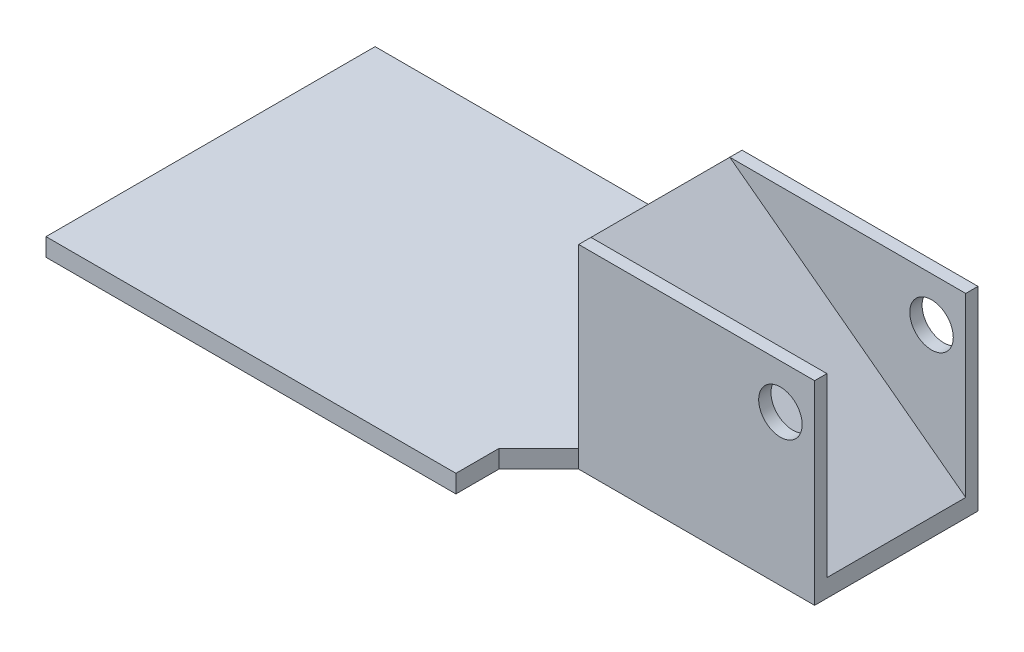
ISO-10303-21;
HEADER;
FILE_DESCRIPTION(('STEP AP214'),'2;1');
FILE_NAME('part.step','',(''),(''),'','','');
FILE_SCHEMA(('AUTOMOTIVE_DESIGN { 1 0 10303 214 1 1 1 1 }'));
ENDSEC;
DATA;
#1=APPLICATION_CONTEXT('core data for automotive mechanical design processes');
#2=APPLICATION_PROTOCOL_DEFINITION('international standard','automotive_design',2000,#1);
#3=PRODUCT_CONTEXT('',#1,'mechanical');
#4=PRODUCT('Part','Part','',(#3));
#5=PRODUCT_RELATED_PRODUCT_CATEGORY('part','',(#4));
#6=PRODUCT_DEFINITION_FORMATION('','',#4);
#7=PRODUCT_DEFINITION_CONTEXT('part definition',#1,'design');
#8=PRODUCT_DEFINITION('design','',#6,#7);
#9=PRODUCT_DEFINITION_SHAPE('','',#8);
#10=(LENGTH_UNIT() NAMED_UNIT(*) SI_UNIT(.MILLI.,.METRE.));
#11=(NAMED_UNIT(*) PLANE_ANGLE_UNIT() SI_UNIT($,.RADIAN.));
#12=(NAMED_UNIT(*) SI_UNIT($,.STERADIAN.) SOLID_ANGLE_UNIT());
#13=UNCERTAINTY_MEASURE_WITH_UNIT(LENGTH_MEASURE(1.E-05),#10,'distance_accuracy_value','');
#14=(GEOMETRIC_REPRESENTATION_CONTEXT(3) GLOBAL_UNCERTAINTY_ASSIGNED_CONTEXT((#13)) GLOBAL_UNIT_ASSIGNED_CONTEXT((#10,
#11,#12)) REPRESENTATION_CONTEXT('',''));
#15=CARTESIAN_POINT('',(0.,0.,0.));
#16=DIRECTION('',(0.,0.,1.));
#17=DIRECTION('',(1.,0.,0.));
#18=AXIS2_PLACEMENT_3D('',#15,#16,#17);
#19=CARTESIAN_POINT('',(0.,2.05994,0.));
#20=DIRECTION('',(0.,1.,0.));
#21=DIRECTION('',(0.,0.,1.));
#22=AXIS2_PLACEMENT_3D('',#19,#20,#21);
#23=PLANE('',#22);
#24=DIRECTION('',(-1.,0.,0.));
#25=VECTOR('',#24,1.);
#26=CARTESIAN_POINT('',(6.75557992798762,2.05994,29.8060041441728));
#27=LINE('',#26,#25);
#28=CARTESIAN_POINT('',(30.5689196087146,2.05994,29.8060041441728));
#29=VERTEX_POINT('',#28);
#30=CARTESIAN_POINT('',(6.75557992798762,2.05994,29.8060041441728));
#31=VERTEX_POINT('',#30);
#32=EDGE_CURVE('E201',#29,#31,#27,.T.);
#33=ORIENTED_EDGE('',*,*,#32,.F.);
#34=DIRECTION('',(0.,0.,-1.));
#35=VECTOR('',#34,1.);
#36=CARTESIAN_POINT('',(30.5689196087146,2.05994,29.8717192340563));
#37=LINE('',#36,#35);
#38=CARTESIAN_POINT('',(30.5689196087146,2.05994,13.8417792340563));
#39=VERTEX_POINT('',#38);
#40=EDGE_CURVE('E57',#29,#39,#37,.T.);
#41=ORIENTED_EDGE('',*,*,#40,.T.);
#42=DIRECTION('',(1.,0.,0.));
#43=VECTOR('',#42,1.);
#44=CARTESIAN_POINT('',(33.8878599279876,2.05994,13.8417792340563));
#45=LINE('',#44,#43);
#46=CARTESIAN_POINT('',(6.75557992798762,2.05994,13.8417792340563));
#47=VERTEX_POINT('',#46);
#48=EDGE_CURVE('E223',#47,#39,#45,.T.);
#49=ORIENTED_EDGE('',*,*,#48,.F.);
#50=DIRECTION('',(0.,0.,1.));
#51=VECTOR('',#50,1.);
#52=CARTESIAN_POINT('',(6.75557992798762,2.05994,13.8417792340563));
#53=LINE('',#52,#51);
#54=CARTESIAN_POINT('',(6.75557992798762,2.05994,12.4295392340563));
#55=VERTEX_POINT('',#54);
#56=EDGE_CURVE('E164',#55,#47,#53,.T.);
#57=ORIENTED_EDGE('',*,*,#56,.F.);
#58=DIRECTION('',(-0.707106781186546,0.,-0.707106781186549));
#59=VECTOR('',#58,1.);
#60=CARTESIAN_POINT('',(2.16579992798763,2.05994,7.83975923405626));
#61=LINE('',#60,#59);
#62=CARTESIAN_POINT('',(2.16579992798763,2.05994,7.83975923405626));
#63=VERTEX_POINT('',#62);
#64=EDGE_CURVE('E176',#55,#63,#61,.T.);
#65=ORIENTED_EDGE('',*,*,#64,.T.);
#66=DIRECTION('',(0.,0.,-1.));
#67=VECTOR('',#66,1.);
#68=CARTESIAN_POINT('',(2.16579992798763,2.05994,7.83975923405626));
#69=LINE('',#68,#67);
#70=CARTESIAN_POINT('',(2.16579992798763,2.05994,2.90089168911453));
#71=VERTEX_POINT('',#70);
#72=EDGE_CURVE('E251',#63,#71,#69,.T.);
#73=ORIENTED_EDGE('',*,*,#72,.T.);
#74=DIRECTION('',(-1.,0.,0.));
#75=VECTOR('',#74,1.);
#76=CARTESIAN_POINT('',(2.16579992798763,2.05994,2.90089168911453));
#77=LINE('',#76,#75);
#78=CARTESIAN_POINT('',(-44.9740600720124,2.05994,2.90089168911454));
#79=VERTEX_POINT('',#78);
#80=EDGE_CURVE('E239',#71,#79,#77,.T.);
#81=ORIENTED_EDGE('',*,*,#80,.T.);
#82=DIRECTION('',(0.,0.,1.));
#83=VECTOR('',#82,1.);
#84=CARTESIAN_POINT('',(-44.9740600720124,2.05994,2.90089168911454));
#85=LINE('',#84,#83);
#86=CARTESIAN_POINT('',(-44.9740600720124,2.05994,40.7468916891145));
#87=VERTEX_POINT('',#86);
#88=EDGE_CURVE('E242',#79,#87,#85,.T.);
#89=ORIENTED_EDGE('',*,*,#88,.T.);
#90=DIRECTION('',(1.,0.,0.));
#91=VECTOR('',#90,1.);
#92=CARTESIAN_POINT('',(-44.9740600720124,2.05994,40.7468916891145));
#93=LINE('',#92,#91);
#94=CARTESIAN_POINT('',(2.16579992798763,2.05994,40.7468916891145));
#95=VERTEX_POINT('',#94);
#96=EDGE_CURVE('E245',#87,#95,#93,.T.);
#97=ORIENTED_EDGE('',*,*,#96,.T.);
#98=DIRECTION('',(0.,0.,-1.));
#99=VECTOR('',#98,1.);
#100=CARTESIAN_POINT('',(2.16579992798763,2.05994,40.7468916891145));
#101=LINE('',#100,#99);
#102=CARTESIAN_POINT('',(2.16579992798763,2.05994,35.8080241441727));
#103=VERTEX_POINT('',#102);
#104=EDGE_CURVE('E247',#95,#103,#101,.T.);
#105=ORIENTED_EDGE('',*,*,#104,.T.);
#106=DIRECTION('',(0.707106781186552,0.,-0.707106781186543));
#107=VECTOR('',#106,1.);
#108=CARTESIAN_POINT('',(6.75557992798762,2.05994,31.2182441441728));
#109=LINE('',#108,#107);
#110=CARTESIAN_POINT('',(6.75557992798762,2.05994,31.2182441441728));
#111=VERTEX_POINT('',#110);
#112=EDGE_CURVE('E177',#103,#111,#109,.T.);
#113=ORIENTED_EDGE('',*,*,#112,.T.);
#114=DIRECTION('',(0.,0.,1.));
#115=VECTOR('',#114,1.);
#116=CARTESIAN_POINT('',(6.75557992798762,2.05994,31.2182441441728));
#117=LINE('',#116,#115);
#118=EDGE_CURVE('E204',#31,#111,#117,.T.);
#119=ORIENTED_EDGE('',*,*,#118,.F.);
#120=EDGE_LOOP('',(#33,#41,#49,#57,#65,#73,#81,#89,#97,#105,#113,#119));
#121=FACE_BOUND('',#120,.T.);
#122=ADVANCED_FACE('F33',(#121),#23,.T.);
#123=CARTESIAN_POINT('',(33.8878599279876,22.37994,13.8417792340563));
#124=DIRECTION('',(0.,0.,-1.));
#125=DIRECTION('',(-1.,0.,0.));
#126=AXIS2_PLACEMENT_3D('',#123,#124,#125);
#127=PLANE('',#126);
#128=DIRECTION('',(0.801501870641229,-0.59799226697225,0.));
#129=VECTOR('',#128,1.);
#130=CARTESIAN_POINT('',(6.75557992798762,19.8268267677945,13.8417792340563));
#131=LINE('',#130,#129);
#132=CARTESIAN_POINT('',(6.75557992798763,19.8268267677945,13.8417792340563));
#133=VERTEX_POINT('',#132);
#134=EDGE_CURVE('E49',#133,#39,#131,.T.);
#135=ORIENTED_EDGE('',*,*,#134,.F.);
#136=DIRECTION('',(0.,-1.,0.));
#137=VECTOR('',#136,1.);
#138=CARTESIAN_POINT('',(6.75557992798762,22.37994,13.8417792340563));
#139=LINE('',#138,#137);
#140=EDGE_CURVE('E233',#133,#47,#139,.T.);
#141=ORIENTED_EDGE('',*,*,#140,.T.);
#142=ORIENTED_EDGE('',*,*,#48,.T.);
#143=EDGE_LOOP('',(#135,#141,#142));
#144=FACE_BOUND('',#143,.T.);
#145=ADVANCED_FACE('F376',(#144),#127,.F.);
#146=CARTESIAN_POINT('',(29.9559399279876,17.2847,13.8417792340563));
#147=DIRECTION('',(0.,0.,-1.));
#148=DIRECTION('',(-1.,0.,0.));
#149=AXIS2_PLACEMENT_3D('',#146,#147,#148);
#150=CIRCLE('',#149,2.50063);
#151=CARTESIAN_POINT('',(27.4553099279876,17.2847,13.8417792340563));
#152=VERTEX_POINT('',#151);
#153=EDGE_CURVE('E195',#152,#152,#150,.T.);
#154=ORIENTED_EDGE('',*,*,#153,.T.);
#155=EDGE_LOOP('',(#154));
#156=FACE_BOUND('',#155,.T.);
#157=DIRECTION('',(-0.800413429281801,0.599448364936754,0.));
#158=VECTOR('',#157,1.);
#159=CARTESIAN_POINT('',(6.75557992798762,22.37994,13.8417792340563));
#160=LINE('',#159,#158);
#161=CARTESIAN_POINT('',(33.8878599279876,2.05994,13.8417792340563));
#162=VERTEX_POINT('',#161);
#163=CARTESIAN_POINT('',(6.75557992798762,22.37994,13.8417792340563));
#164=VERTEX_POINT('',#163);
#165=EDGE_CURVE('E355',#162,#164,#160,.T.);
#166=ORIENTED_EDGE('',*,*,#165,.F.);
#167=DIRECTION('',(0.,-1.,0.));
#168=VECTOR('',#167,1.);
#169=CARTESIAN_POINT('',(33.8878599279876,22.37994,13.8417792340563));
#170=LINE('',#169,#168);
#171=CARTESIAN_POINT('',(33.8878599279876,22.37994,13.8417792340563));
#172=VERTEX_POINT('',#171);
#173=EDGE_CURVE('E173',#172,#162,#170,.T.);
#174=ORIENTED_EDGE('',*,*,#173,.F.);
#175=DIRECTION('',(1.,0.,0.));
#176=VECTOR('',#175,1.);
#177=CARTESIAN_POINT('',(33.8878599279876,22.37994,13.8417792340563));
#178=LINE('',#177,#176);
#179=EDGE_CURVE('E227',#164,#172,#178,.T.);
#180=ORIENTED_EDGE('',*,*,#179,.F.);
#181=EDGE_LOOP('',(#166,#174,#180));
#182=FACE_BOUND('',#181,.T.);
#183=ADVANCED_FACE('F361',(#156,#182),#127,.F.);
#184=CARTESIAN_POINT('',(6.75557992798762,22.37994,29.8060041441728));
#185=DIRECTION('',(0.,0.,1.));
#186=DIRECTION('',(1.,0.,0.));
#187=AXIS2_PLACEMENT_3D('',#184,#185,#186);
#188=PLANE('',#187);
#189=DIRECTION('',(-0.801501870641229,0.59799226697225,0.));
#190=VECTOR('',#189,1.);
#191=CARTESIAN_POINT('',(5.53189338339606,20.7398066592554,29.8060041441728));
#192=LINE('',#191,#190);
#193=CARTESIAN_POINT('',(6.75557992798762,19.8268267677945,29.8060041441728));
#194=VERTEX_POINT('',#193);
#195=EDGE_CURVE('E183',#29,#194,#192,.T.);
#196=ORIENTED_EDGE('',*,*,#195,.F.);
#197=ORIENTED_EDGE('',*,*,#32,.T.);
#198=DIRECTION('',(0.,-1.,0.));
#199=VECTOR('',#198,1.);
#200=CARTESIAN_POINT('',(6.75557992798762,22.37994,29.8060041441728));
#201=LINE('',#200,#199);
#202=EDGE_CURVE('E165',#194,#31,#201,.T.);
#203=ORIENTED_EDGE('',*,*,#202,.F.);
#204=EDGE_LOOP('',(#196,#197,#203));
#205=FACE_BOUND('',#204,.T.);
#206=ADVANCED_FACE('F352',(#205),#188,.F.);
#207=CARTESIAN_POINT('',(29.9559399279876,17.2847,29.8060041441728));
#208=DIRECTION('',(0.,0.,1.));
#209=DIRECTION('',(1.,0.,0.));
#210=AXIS2_PLACEMENT_3D('',#207,#208,#209);
#211=CIRCLE('',#210,2.50063);
#212=CARTESIAN_POINT('',(32.4565699279876,17.2847,29.8060041441728));
#213=VERTEX_POINT('',#212);
#214=EDGE_CURVE('E37',#213,#213,#211,.T.);
#215=ORIENTED_EDGE('',*,*,#214,.T.);
#216=EDGE_LOOP('',(#215));
#217=FACE_BOUND('',#216,.T.);
#218=DIRECTION('',(0.800413429281801,-0.599448364936754,0.));
#219=VECTOR('',#218,1.);
#220=CARTESIAN_POINT('',(6.75557992798762,22.37994,29.8060041441728));
#221=LINE('',#220,#219);
#222=CARTESIAN_POINT('',(6.75557992798762,22.37994,29.8060041441728));
#223=VERTEX_POINT('',#222);
#224=CARTESIAN_POINT('',(33.8878599279876,2.05994,29.8060041441728));
#225=VERTEX_POINT('',#224);
#226=EDGE_CURVE('E158',#223,#225,#221,.T.);
#227=ORIENTED_EDGE('',*,*,#226,.F.);
#228=DIRECTION('',(-1.,0.,0.));
#229=VECTOR('',#228,1.);
#230=CARTESIAN_POINT('',(6.75557992798762,22.37994,29.8060041441728));
#231=LINE('',#230,#229);
#232=CARTESIAN_POINT('',(33.8878599279876,22.37994,29.8060041441728));
#233=VERTEX_POINT('',#232);
#234=EDGE_CURVE('E160',#233,#223,#231,.T.);
#235=ORIENTED_EDGE('',*,*,#234,.F.);
#236=DIRECTION('',(0.,-1.,0.));
#237=VECTOR('',#236,1.);
#238=CARTESIAN_POINT('',(33.8878599279876,22.37994,29.8060041441728));
#239=LINE('',#238,#237);
#240=EDGE_CURVE('E154',#233,#225,#239,.T.);
#241=ORIENTED_EDGE('',*,*,#240,.T.);
#242=EDGE_LOOP('',(#227,#235,#241));
#243=FACE_BOUND('',#242,.T.);
#244=ADVANCED_FACE('F156',(#217,#243),#188,.F.);
#245=CARTESIAN_POINT('',(2.16579992798763,2.05994,2.90089168911453));
#246=DIRECTION('',(0.,0.,1.));
#247=DIRECTION('',(1.,0.,0.));
#248=AXIS2_PLACEMENT_3D('',#245,#246,#247);
#249=PLANE('',#248);
#250=DIRECTION('',(-1.,0.,0.));
#251=VECTOR('',#250,1.);
#252=CARTESIAN_POINT('',(2.16579992798763,0.,2.90089168911453));
#253=LINE('',#252,#251);
#254=CARTESIAN_POINT('',(2.16579992798763,0.,2.90089168911453));
#255=VERTEX_POINT('',#254);
#256=CARTESIAN_POINT('',(-44.9740600720124,0.,2.90089168911454));
#257=VERTEX_POINT('',#256);
#258=EDGE_CURVE('E238',#255,#257,#253,.T.);
#259=ORIENTED_EDGE('',*,*,#258,.T.);
#260=DIRECTION('',(0.,-1.,0.));
#261=VECTOR('',#260,1.);
#262=CARTESIAN_POINT('',(-44.9740600720124,2.05994,2.90089168911454));
#263=LINE('',#262,#261);
#264=EDGE_CURVE('E11',#79,#257,#263,.T.);
#265=ORIENTED_EDGE('',*,*,#264,.F.);
#266=ORIENTED_EDGE('',*,*,#80,.F.);
#267=DIRECTION('',(0.,-1.,0.));
#268=VECTOR('',#267,1.);
#269=CARTESIAN_POINT('',(2.16579992798763,2.05994,2.90089168911453));
#270=LINE('',#269,#268);
#271=EDGE_CURVE('E253',#71,#255,#270,.T.);
#272=ORIENTED_EDGE('',*,*,#271,.T.);
#273=EDGE_LOOP('',(#259,#265,#266,#272));
#274=FACE_BOUND('',#273,.T.);
#275=ADVANCED_FACE('F35',(#274),#249,.F.);
#276=CARTESIAN_POINT('',(-44.9740600720124,2.05994,2.90089168911454));
#277=DIRECTION('',(1.,0.,0.));
#278=DIRECTION('',(0.,0.,-1.));
#279=AXIS2_PLACEMENT_3D('',#276,#277,#278);
#280=PLANE('',#279);
#281=DIRECTION('',(0.,0.,1.));
#282=VECTOR('',#281,1.);
#283=CARTESIAN_POINT('',(-44.9740600720124,0.,2.90089168911454));
#284=LINE('',#283,#282);
#285=CARTESIAN_POINT('',(-44.9740600720124,0.,40.7468916891145));
#286=VERTEX_POINT('',#285);
#287=EDGE_CURVE('E256',#257,#286,#284,.T.);
#288=ORIENTED_EDGE('',*,*,#287,.T.);
#289=DIRECTION('',(0.,-1.,0.));
#290=VECTOR('',#289,1.);
#291=CARTESIAN_POINT('',(-44.9740600720124,2.05994,40.7468916891145));
#292=LINE('',#291,#290);
#293=EDGE_CURVE('E42',#87,#286,#292,.T.);
#294=ORIENTED_EDGE('',*,*,#293,.F.);
#295=ORIENTED_EDGE('',*,*,#88,.F.);
#296=ORIENTED_EDGE('',*,*,#264,.T.);
#297=EDGE_LOOP('',(#288,#294,#295,#296));
#298=FACE_BOUND('',#297,.T.);
#299=ADVANCED_FACE('F321',(#298),#280,.F.);
#300=CARTESIAN_POINT('',(-44.9740600720124,2.05994,40.7468916891145));
#301=DIRECTION('',(0.,0.,-1.));
#302=DIRECTION('',(-1.,0.,0.));
#303=AXIS2_PLACEMENT_3D('',#300,#301,#302);
#304=PLANE('',#303);
#305=DIRECTION('',(1.,0.,0.));
#306=VECTOR('',#305,1.);
#307=CARTESIAN_POINT('',(-44.9740600720124,0.,40.7468916891145));
#308=LINE('',#307,#306);
#309=CARTESIAN_POINT('',(2.16579992798763,0.,40.7468916891145));
#310=VERTEX_POINT('',#309);
#311=EDGE_CURVE('E258',#286,#310,#308,.T.);
#312=ORIENTED_EDGE('',*,*,#311,.T.);
#313=DIRECTION('',(0.,-1.,0.));
#314=VECTOR('',#313,1.);
#315=CARTESIAN_POINT('',(2.16579992798763,2.05994,40.7468916891145));
#316=LINE('',#315,#314);
#317=EDGE_CURVE('E293',#95,#310,#316,.T.);
#318=ORIENTED_EDGE('',*,*,#317,.F.);
#319=ORIENTED_EDGE('',*,*,#96,.F.);
#320=ORIENTED_EDGE('',*,*,#293,.T.);
#321=EDGE_LOOP('',(#312,#318,#319,#320));
#322=FACE_BOUND('',#321,.T.);
#323=ADVANCED_FACE('F301',(#322),#304,.F.);
#324=CARTESIAN_POINT('',(2.16579992798763,2.05994,40.7468916891145));
#325=DIRECTION('',(-1.,0.,0.));
#326=DIRECTION('',(0.,0.,1.));
#327=AXIS2_PLACEMENT_3D('',#324,#325,#326);
#328=PLANE('',#327);
#329=DIRECTION('',(0.,0.,-1.));
#330=VECTOR('',#329,1.);
#331=CARTESIAN_POINT('',(2.16579992798763,0.,40.7468916891145));
#332=LINE('',#331,#330);
#333=CARTESIAN_POINT('',(2.16579992798763,0.,35.8080241441727));
#334=VERTEX_POINT('',#333);
#335=EDGE_CURVE('E260',#310,#334,#332,.T.);
#336=ORIENTED_EDGE('',*,*,#335,.T.);
#337=DIRECTION('',(0.,-1.,0.));
#338=VECTOR('',#337,1.);
#339=CARTESIAN_POINT('',(2.16579992798763,2.05994,35.8080241441727));
#340=LINE('',#339,#338);
#341=EDGE_CURVE('E290',#103,#334,#340,.T.);
#342=ORIENTED_EDGE('',*,*,#341,.F.);
#343=ORIENTED_EDGE('',*,*,#104,.F.);
#344=ORIENTED_EDGE('',*,*,#317,.T.);
#345=EDGE_LOOP('',(#336,#342,#343,#344));
#346=FACE_BOUND('',#345,.T.);
#347=ADVANCED_FACE('F312',(#346),#328,.F.);
#348=CARTESIAN_POINT('',(6.75557992798762,2.05994,31.2182441441728));
#349=DIRECTION('',(-0.707106781186543,0.,-0.707106781186552));
#350=DIRECTION('',(-0.707106781186552,0.,0.707106781186543));
#351=AXIS2_PLACEMENT_3D('',#348,#349,#350);
#352=PLANE('',#351);
#353=DIRECTION('',(0.707106781186552,0.,-0.707106781186543));
#354=VECTOR('',#353,1.);
#355=CARTESIAN_POINT('',(6.75557992798762,0.,31.2182441441728));
#356=LINE('',#355,#354);
#357=CARTESIAN_POINT('',(6.75557992798762,0.,31.2182441441728));
#358=VERTEX_POINT('',#357);
#359=EDGE_CURVE('E262',#334,#358,#356,.T.);
#360=ORIENTED_EDGE('',*,*,#359,.T.);
#361=DIRECTION('',(0.,-1.,0.));
#362=VECTOR('',#361,1.);
#363=CARTESIAN_POINT('',(6.75557992798762,2.05994,31.2182441441728));
#364=LINE('',#363,#362);
#365=EDGE_CURVE('E287',#111,#358,#364,.T.);
#366=ORIENTED_EDGE('',*,*,#365,.F.);
#367=ORIENTED_EDGE('',*,*,#112,.F.);
#368=ORIENTED_EDGE('',*,*,#341,.T.);
#369=EDGE_LOOP('',(#360,#366,#367,#368));
#370=FACE_BOUND('',#369,.T.);
#371=ADVANCED_FACE('F316',(#370),#352,.F.);
#372=CARTESIAN_POINT('',(33.8878599279876,2.05994,31.2182441441728));
#373=DIRECTION('',(0.,0.,-1.));
#374=DIRECTION('',(-1.,0.,0.));
#375=AXIS2_PLACEMENT_3D('',#372,#373,#374);
#376=PLANE('',#375);
#377=CARTESIAN_POINT('',(29.9559399279876,17.2847,31.2182441441728));
#378=DIRECTION('',(0.,0.,1.));
#379=DIRECTION('',(1.,0.,0.));
#380=AXIS2_PLACEMENT_3D('',#377,#378,#379);
#381=CIRCLE('',#380,2.50063);
#382=CARTESIAN_POINT('',(32.4565699279876,17.2847,31.2182441441728));
#383=VERTEX_POINT('',#382);
#384=EDGE_CURVE('E187',#383,#383,#381,.T.);
#385=ORIENTED_EDGE('',*,*,#384,.F.);
#386=EDGE_LOOP('',(#385));
#387=FACE_BOUND('',#386,.T.);
#388=DIRECTION('',(1.,0.,0.));
#389=VECTOR('',#388,1.);
#390=CARTESIAN_POINT('',(33.8878599279876,0.,31.2182441441728));
#391=LINE('',#390,#389);
#392=CARTESIAN_POINT('',(33.8878599279876,0.,31.2182441441728));
#393=VERTEX_POINT('',#392);
#394=EDGE_CURVE('E264',#358,#393,#391,.T.);
#395=ORIENTED_EDGE('',*,*,#394,.T.);
#396=DIRECTION('',(0.,-1.,0.));
#397=VECTOR('',#396,1.);
#398=CARTESIAN_POINT('',(33.8878599279876,2.05994,31.2182441441728));
#399=LINE('',#398,#397);
#400=CARTESIAN_POINT('',(33.8878599279876,22.37994,31.2182441441728));
#401=VERTEX_POINT('',#400);
#402=EDGE_CURVE('E284',#401,#393,#399,.T.);
#403=ORIENTED_EDGE('',*,*,#402,.F.);
#404=DIRECTION('',(1.,0.,0.));
#405=VECTOR('',#404,1.);
#406=CARTESIAN_POINT('',(33.8878599279876,22.37994,31.2182441441728));
#407=LINE('',#406,#405);
#408=CARTESIAN_POINT('',(6.75557992798762,22.37994,31.2182441441728));
#409=VERTEX_POINT('',#408);
#410=EDGE_CURVE('E208',#409,#401,#407,.T.);
#411=ORIENTED_EDGE('',*,*,#410,.F.);
#412=DIRECTION('',(0.,-1.,0.));
#413=VECTOR('',#412,1.);
#414=CARTESIAN_POINT('',(6.75557992798762,22.37994,31.2182441441728));
#415=LINE('',#414,#413);
#416=EDGE_CURVE('E211',#409,#111,#415,.T.);
#417=ORIENTED_EDGE('',*,*,#416,.T.);
#418=ORIENTED_EDGE('',*,*,#365,.T.);
#419=EDGE_LOOP('',(#395,#403,#411,#417,#418));
#420=FACE_BOUND('',#419,.T.);
#421=ADVANCED_FACE('F343',(#387,#420),#376,.F.);
#422=CARTESIAN_POINT('',(33.8878599279876,2.05994,12.4295392340563));
#423=DIRECTION('',(-1.,0.,0.));
#424=DIRECTION('',(0.,0.,1.));
#425=AXIS2_PLACEMENT_3D('',#422,#423,#424);
#426=PLANE('',#425);
#427=DIRECTION('',(0.,0.,-1.));
#428=VECTOR('',#427,1.);
#429=CARTESIAN_POINT('',(33.8878599279876,0.,12.4295392340563));
#430=LINE('',#429,#428);
#431=CARTESIAN_POINT('',(33.8878599279876,0.,12.4295392340563));
#432=VERTEX_POINT('',#431);
#433=EDGE_CURVE('E266',#393,#432,#430,.T.);
#434=ORIENTED_EDGE('',*,*,#433,.T.);
#435=DIRECTION('',(0.,-1.,0.));
#436=VECTOR('',#435,1.);
#437=CARTESIAN_POINT('',(33.8878599279876,2.05994,12.4295392340563));
#438=LINE('',#437,#436);
#439=CARTESIAN_POINT('',(33.8878599279876,22.37994,12.4295392340563));
#440=VERTEX_POINT('',#439);
#441=EDGE_CURVE('E281',#440,#432,#438,.T.);
#442=ORIENTED_EDGE('',*,*,#441,.F.);
#443=DIRECTION('',(0.,0.,-1.));
#444=VECTOR('',#443,1.);
#445=CARTESIAN_POINT('',(33.8878599279876,22.37994,12.4295392340563));
#446=LINE('',#445,#444);
#447=EDGE_CURVE('E219',#172,#440,#446,.T.);
#448=ORIENTED_EDGE('',*,*,#447,.F.);
#449=ORIENTED_EDGE('',*,*,#173,.T.);
#450=DIRECTION('',(0.,0.,-1.));
#451=VECTOR('',#450,1.);
#452=CARTESIAN_POINT('',(33.8878599279876,2.05994,12.4295392340563));
#453=LINE('',#452,#451);
#454=EDGE_CURVE('E169',#225,#162,#453,.T.);
#455=ORIENTED_EDGE('',*,*,#454,.F.);
#456=ORIENTED_EDGE('',*,*,#240,.F.);
#457=DIRECTION('',(0.,0.,-1.));
#458=VECTOR('',#457,1.);
#459=CARTESIAN_POINT('',(33.8878599279876,22.37994,29.8060041441728));
#460=LINE('',#459,#458);
#461=EDGE_CURVE('E202',#401,#233,#460,.T.);
#462=ORIENTED_EDGE('',*,*,#461,.F.);
#463=ORIENTED_EDGE('',*,*,#402,.T.);
#464=EDGE_LOOP('',(#434,#442,#448,#449,#455,#456,#462,#463));
#465=FACE_BOUND('',#464,.T.);
#466=ADVANCED_FACE('F170',(#465),#426,.F.);
#467=CARTESIAN_POINT('',(6.75557992798762,2.05994,12.4295392340563));
#468=DIRECTION('',(0.,0.,1.));
#469=DIRECTION('',(1.,0.,0.));
#470=AXIS2_PLACEMENT_3D('',#467,#468,#469);
#471=PLANE('',#470);
#472=CARTESIAN_POINT('',(29.9559399279876,17.2847,12.4295392340563));
#473=DIRECTION('',(0.,0.,1.));
#474=DIRECTION('',(1.,0.,0.));
#475=AXIS2_PLACEMENT_3D('',#472,#473,#474);
#476=CIRCLE('',#475,2.50063);
#477=CARTESIAN_POINT('',(32.4565699279876,17.2847,12.4295392340563));
#478=VERTEX_POINT('',#477);
#479=EDGE_CURVE('E198',#478,#478,#476,.T.);
#480=ORIENTED_EDGE('',*,*,#479,.T.);
#481=EDGE_LOOP('',(#480));
#482=FACE_BOUND('',#481,.T.);
#483=DIRECTION('',(-1.,0.,0.));
#484=VECTOR('',#483,1.);
#485=CARTESIAN_POINT('',(6.75557992798762,0.,12.4295392340563));
#486=LINE('',#485,#484);
#487=CARTESIAN_POINT('',(6.75557992798762,0.,12.4295392340563));
#488=VERTEX_POINT('',#487);
#489=EDGE_CURVE('E268',#432,#488,#486,.T.);
#490=ORIENTED_EDGE('',*,*,#489,.T.);
#491=DIRECTION('',(0.,-1.,0.));
#492=VECTOR('',#491,1.);
#493=CARTESIAN_POINT('',(6.75557992798762,2.05994,12.4295392340563));
#494=LINE('',#493,#492);
#495=EDGE_CURVE('E278',#55,#488,#494,.T.);
#496=ORIENTED_EDGE('',*,*,#495,.F.);
#497=DIRECTION('',(0.,-1.,0.));
#498=VECTOR('',#497,1.);
#499=CARTESIAN_POINT('',(6.75557992798762,22.37994,12.4295392340563));
#500=LINE('',#499,#498);
#501=CARTESIAN_POINT('',(6.75557992798762,22.37994,12.4295392340563));
#502=VERTEX_POINT('',#501);
#503=EDGE_CURVE('E235',#502,#55,#500,.T.);
#504=ORIENTED_EDGE('',*,*,#503,.F.);
#505=DIRECTION('',(-1.,0.,0.));
#506=VECTOR('',#505,1.);
#507=CARTESIAN_POINT('',(6.75557992798762,22.37994,12.4295392340563));
#508=LINE('',#507,#506);
#509=EDGE_CURVE('E222',#440,#502,#508,.T.);
#510=ORIENTED_EDGE('',*,*,#509,.F.);
#511=ORIENTED_EDGE('',*,*,#441,.T.);
#512=EDGE_LOOP('',(#490,#496,#504,#510,#511));
#513=FACE_BOUND('',#512,.T.);
#514=ADVANCED_FACE('F337',(#482,#513),#471,.F.);
#515=CARTESIAN_POINT('',(2.16579992798763,2.05994,7.83975923405626));
#516=DIRECTION('',(-0.707106781186549,0.,0.707106781186546));
#517=DIRECTION('',(0.707106781186546,0.,0.707106781186549));
#518=AXIS2_PLACEMENT_3D('',#515,#516,#517);
#519=PLANE('',#518);
#520=DIRECTION('',(-0.707106781186546,0.,-0.707106781186549));
#521=VECTOR('',#520,1.);
#522=CARTESIAN_POINT('',(2.16579992798763,0.,7.83975923405626));
#523=LINE('',#522,#521);
#524=CARTESIAN_POINT('',(2.16579992798763,0.,7.83975923405626));
#525=VERTEX_POINT('',#524);
#526=EDGE_CURVE('E270',#488,#525,#523,.T.);
#527=ORIENTED_EDGE('',*,*,#526,.T.);
#528=DIRECTION('',(0.,-1.,0.));
#529=VECTOR('',#528,1.);
#530=CARTESIAN_POINT('',(2.16579992798763,2.05994,7.83975923405626));
#531=LINE('',#530,#529);
#532=EDGE_CURVE('E275',#63,#525,#531,.T.);
#533=ORIENTED_EDGE('',*,*,#532,.F.);
#534=ORIENTED_EDGE('',*,*,#64,.F.);
#535=ORIENTED_EDGE('',*,*,#495,.T.);
#536=EDGE_LOOP('',(#527,#533,#534,#535));
#537=FACE_BOUND('',#536,.T.);
#538=ADVANCED_FACE('F333',(#537),#519,.F.);
#539=CARTESIAN_POINT('',(2.16579992798763,2.05994,7.83975923405626));
#540=DIRECTION('',(-1.,0.,0.));
#541=DIRECTION('',(0.,0.,1.));
#542=AXIS2_PLACEMENT_3D('',#539,#540,#541);
#543=PLANE('',#542);
#544=DIRECTION('',(0.,0.,-1.));
#545=VECTOR('',#544,1.);
#546=CARTESIAN_POINT('',(2.16579992798763,0.,7.83975923405626));
#547=LINE('',#546,#545);
#548=EDGE_CURVE('E243',#525,#255,#547,.T.);
#549=ORIENTED_EDGE('',*,*,#548,.T.);
#550=ORIENTED_EDGE('',*,*,#271,.F.);
#551=ORIENTED_EDGE('',*,*,#72,.F.);
#552=ORIENTED_EDGE('',*,*,#532,.T.);
#553=EDGE_LOOP('',(#549,#550,#551,#552));
#554=FACE_BOUND('',#553,.T.);
#555=ADVANCED_FACE('F328',(#554),#543,.F.);
#556=CARTESIAN_POINT('',(0.,0.,0.));
#557=DIRECTION('',(0.,1.,0.));
#558=DIRECTION('',(0.,0.,1.));
#559=AXIS2_PLACEMENT_3D('',#556,#557,#558);
#560=PLANE('',#559);
#561=ORIENTED_EDGE('',*,*,#258,.F.);
#562=ORIENTED_EDGE('',*,*,#548,.F.);
#563=ORIENTED_EDGE('',*,*,#526,.F.);
#564=ORIENTED_EDGE('',*,*,#489,.F.);
#565=ORIENTED_EDGE('',*,*,#433,.F.);
#566=ORIENTED_EDGE('',*,*,#394,.F.);
#567=ORIENTED_EDGE('',*,*,#359,.F.);
#568=ORIENTED_EDGE('',*,*,#335,.F.);
#569=ORIENTED_EDGE('',*,*,#311,.F.);
#570=ORIENTED_EDGE('',*,*,#287,.F.);
#571=EDGE_LOOP('',(#561,#562,#563,#564,#565,#566,#567,#568,#569,#570));
#572=FACE_BOUND('',#571,.T.);
#573=ADVANCED_FACE('F307',(#572),#560,.F.);
#574=CARTESIAN_POINT('',(6.75557992798762,22.37994,13.8417792340563));
#575=DIRECTION('',(1.,0.,0.));
#576=DIRECTION('',(0.,0.,-1.));
#577=AXIS2_PLACEMENT_3D('',#574,#575,#576);
#578=PLANE('',#577);
#579=ORIENTED_EDGE('',*,*,#56,.T.);
#580=ORIENTED_EDGE('',*,*,#140,.F.);
#581=DIRECTION('',(0.,0.,-1.));
#582=VECTOR('',#581,1.);
#583=CARTESIAN_POINT('',(6.75557992798762,19.8268267677945,29.8717192340563));
#584=LINE('',#583,#582);
#585=EDGE_CURVE('E184',#194,#133,#584,.T.);
#586=ORIENTED_EDGE('',*,*,#585,.F.);
#587=ORIENTED_EDGE('',*,*,#202,.T.);
#588=ORIENTED_EDGE('',*,*,#118,.T.);
#589=ORIENTED_EDGE('',*,*,#416,.F.);
#590=DIRECTION('',(0.,0.,1.));
#591=VECTOR('',#590,1.);
#592=CARTESIAN_POINT('',(6.75557992798762,22.37994,31.2182441441728));
#593=LINE('',#592,#591);
#594=EDGE_CURVE('E206',#223,#409,#593,.T.);
#595=ORIENTED_EDGE('',*,*,#594,.F.);
#596=DIRECTION('',(0.,0.,-1.));
#597=VECTOR('',#596,1.);
#598=CARTESIAN_POINT('',(6.75557992798762,22.37994,29.8717192340563));
#599=LINE('',#598,#597);
#600=EDGE_CURVE('E182',#223,#164,#599,.T.);
#601=ORIENTED_EDGE('',*,*,#600,.T.);
#602=DIRECTION('',(0.,0.,1.));
#603=VECTOR('',#602,1.);
#604=CARTESIAN_POINT('',(6.75557992798762,22.37994,13.8417792340563));
#605=LINE('',#604,#603);
#606=EDGE_CURVE('E225',#502,#164,#605,.T.);
#607=ORIENTED_EDGE('',*,*,#606,.F.);
#608=ORIENTED_EDGE('',*,*,#503,.T.);
#609=EDGE_LOOP('',(#579,#580,#586,#587,#588,#589,#595,#601,#607,#608));
#610=FACE_BOUND('',#609,.T.);
#611=ADVANCED_FACE('F349',(#610),#578,.F.);
#612=CARTESIAN_POINT('',(0.,22.37994,0.));
#613=DIRECTION('',(0.,-1.,0.));
#614=DIRECTION('',(0.,0.,-1.));
#615=AXIS2_PLACEMENT_3D('',#612,#613,#614);
#616=PLANE('',#615);
#617=ORIENTED_EDGE('',*,*,#447,.T.);
#618=ORIENTED_EDGE('',*,*,#509,.T.);
#619=ORIENTED_EDGE('',*,*,#606,.T.);
#620=ORIENTED_EDGE('',*,*,#179,.T.);
#621=EDGE_LOOP('',(#617,#618,#619,#620));
#622=FACE_BOUND('',#621,.T.);
#623=ADVANCED_FACE('F363',(#622),#616,.F.);
#624=CARTESIAN_POINT('',(0.,22.37994,0.));
#625=DIRECTION('',(0.,-1.,0.));
#626=DIRECTION('',(0.,0.,-1.));
#627=AXIS2_PLACEMENT_3D('',#624,#625,#626);
#628=PLANE('',#627);
#629=ORIENTED_EDGE('',*,*,#461,.T.);
#630=ORIENTED_EDGE('',*,*,#234,.T.);
#631=ORIENTED_EDGE('',*,*,#594,.T.);
#632=ORIENTED_EDGE('',*,*,#410,.T.);
#633=EDGE_LOOP('',(#629,#630,#631,#632));
#634=FACE_BOUND('',#633,.T.);
#635=ADVANCED_FACE('F345',(#634),#628,.F.);
#636=CARTESIAN_POINT('',(29.9559399279876,17.2847,5.8182441441728));
#637=DIRECTION('',(0.,0.,1.));
#638=DIRECTION('',(1.,0.,0.));
#639=AXIS2_PLACEMENT_3D('',#636,#637,#638);
#640=CYLINDRICAL_SURFACE('',#639,2.50063);
#641=ORIENTED_EDGE('',*,*,#384,.T.);
#642=EDGE_LOOP('',(#641));
#643=FACE_BOUND('',#642,.T.);
#644=ORIENTED_EDGE('',*,*,#214,.F.);
#645=EDGE_LOOP('',(#644));
#646=FACE_BOUND('',#645,.T.);
#647=ADVANCED_FACE('F370',(#643,#646),#640,.F.);
#648=ORIENTED_EDGE('',*,*,#153,.F.);
#649=EDGE_LOOP('',(#648));
#650=FACE_BOUND('',#649,.T.);
#651=ORIENTED_EDGE('',*,*,#479,.F.);
#652=EDGE_LOOP('',(#651));
#653=FACE_BOUND('',#652,.T.);
#654=ADVANCED_FACE('F414',(#650,#653),#640,.F.);
#655=CARTESIAN_POINT('',(6.75557992798762,19.8268267677945,29.8717192340563));
#656=DIRECTION('',(0.59799226697225,0.801501870641229,0.));
#657=DIRECTION('',(-0.801501870641229,0.59799226697225,0.));
#658=AXIS2_PLACEMENT_3D('',#655,#656,#657);
#659=PLANE('',#658);
#660=ORIENTED_EDGE('',*,*,#40,.F.);
#661=ORIENTED_EDGE('',*,*,#195,.T.);
#662=ORIENTED_EDGE('',*,*,#585,.T.);
#663=ORIENTED_EDGE('',*,*,#134,.T.);
#664=EDGE_LOOP('',(#660,#661,#662,#663));
#665=FACE_BOUND('',#664,.T.);
#666=ADVANCED_FACE('F354',(#665),#659,.F.);
#667=CARTESIAN_POINT('',(6.75557992798762,22.37994,29.8717192340563));
#668=DIRECTION('',(-0.599448364936754,-0.800413429281801,0.));
#669=DIRECTION('',(0.800413429281801,-0.599448364936754,0.));
#670=AXIS2_PLACEMENT_3D('',#667,#668,#669);
#671=PLANE('',#670);
#672=ORIENTED_EDGE('',*,*,#600,.F.);
#673=ORIENTED_EDGE('',*,*,#226,.T.);
#674=ORIENTED_EDGE('',*,*,#454,.T.);
#675=ORIENTED_EDGE('',*,*,#165,.T.);
#676=EDGE_LOOP('',(#672,#673,#674,#675));
#677=FACE_BOUND('',#676,.T.);
#678=ADVANCED_FACE('F180',(#677),#671,.F.);
#679=CLOSED_SHELL('',(#122,#145,#183,#206,#244,#275,#299,#323,#347,#371,#421,#466,#514,#538,
#555,#573,#611,#623,#635,#647,#654,#666,#678));
#680=MANIFOLD_SOLID_BREP('B2',#679);
#681=ADVANCED_BREP_SHAPE_REPRESENTATION('',(#18,#680),#14);
#682=SHAPE_DEFINITION_REPRESENTATION(#9,#681);
ENDSEC;
END-ISO-10303-21;
